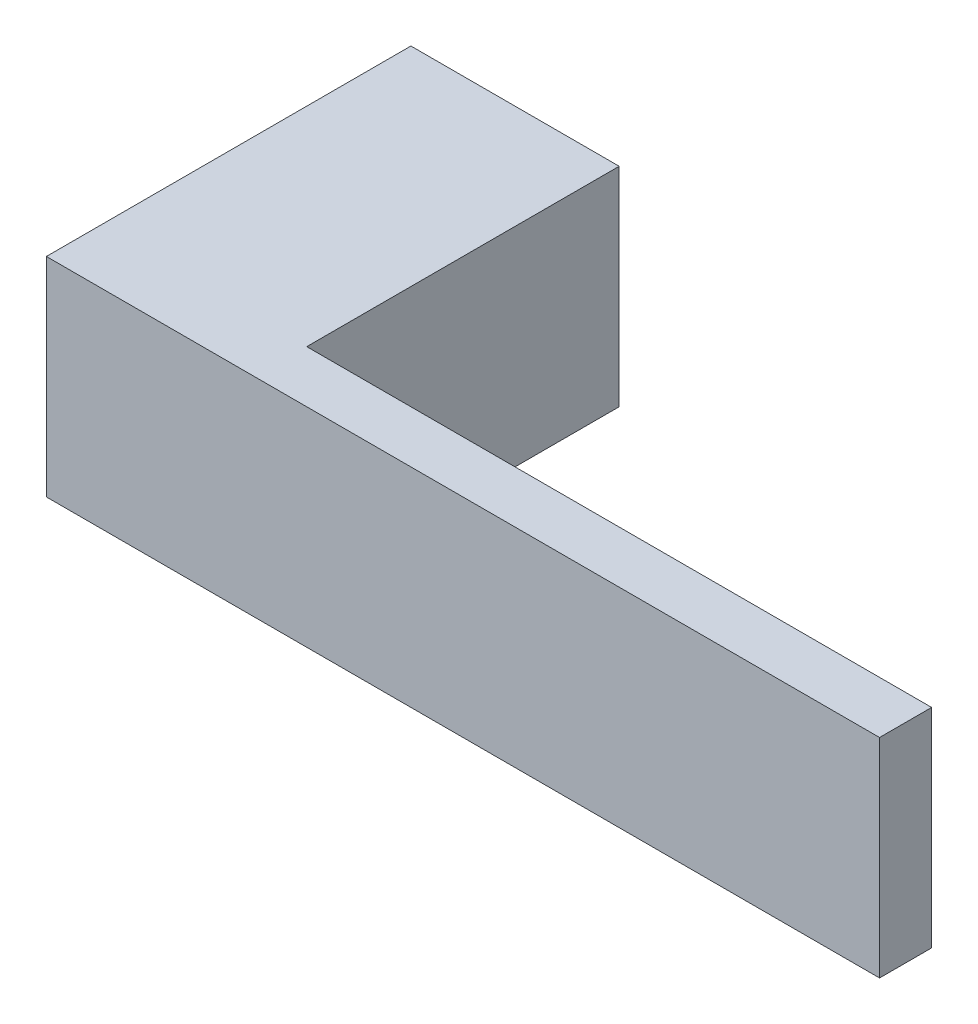
ISO-10303-21;
HEADER;
FILE_DESCRIPTION(('STEP AP214'),'2;1');
FILE_NAME('part.step','',(''),(''),'','','');
FILE_SCHEMA(('AUTOMOTIVE_DESIGN { 1 0 10303 214 1 1 1 1 }'));
ENDSEC;
DATA;
#1=APPLICATION_CONTEXT('core data for automotive mechanical design processes');
#2=APPLICATION_PROTOCOL_DEFINITION('international standard','automotive_design',2000,#1);
#3=PRODUCT_CONTEXT('',#1,'mechanical');
#4=PRODUCT('Part','Part','',(#3));
#5=PRODUCT_RELATED_PRODUCT_CATEGORY('part','',(#4));
#6=PRODUCT_DEFINITION_FORMATION('','',#4);
#7=PRODUCT_DEFINITION_CONTEXT('part definition',#1,'design');
#8=PRODUCT_DEFINITION('design','',#6,#7);
#9=PRODUCT_DEFINITION_SHAPE('','',#8);
#10=(LENGTH_UNIT() NAMED_UNIT(*) SI_UNIT(.MILLI.,.METRE.));
#11=(NAMED_UNIT(*) PLANE_ANGLE_UNIT() SI_UNIT($,.RADIAN.));
#12=(NAMED_UNIT(*) SI_UNIT($,.STERADIAN.) SOLID_ANGLE_UNIT());
#13=UNCERTAINTY_MEASURE_WITH_UNIT(LENGTH_MEASURE(1.E-05),#10,'distance_accuracy_value','');
#14=(GEOMETRIC_REPRESENTATION_CONTEXT(3) GLOBAL_UNCERTAINTY_ASSIGNED_CONTEXT((#13)) GLOBAL_UNIT_ASSIGNED_CONTEXT((#10,
#11,#12)) REPRESENTATION_CONTEXT('',''));
#15=CARTESIAN_POINT('',(0.,0.,0.));
#16=DIRECTION('',(0.,0.,1.));
#17=DIRECTION('',(1.,0.,0.));
#18=AXIS2_PLACEMENT_3D('',#15,#16,#17);
#19=CARTESIAN_POINT('',(80.,20.,35.));
#20=DIRECTION('',(-1.,0.,0.));
#21=DIRECTION('',(0.,0.,1.));
#22=AXIS2_PLACEMENT_3D('',#19,#20,#21);
#23=PLANE('',#22);
#24=DIRECTION('',(0.,0.,-1.));
#25=VECTOR('',#24,1.);
#26=CARTESIAN_POINT('',(80.,0.,35.));
#27=LINE('',#26,#25);
#28=CARTESIAN_POINT('',(80.,0.,35.));
#29=VERTEX_POINT('',#28);
#30=CARTESIAN_POINT('',(80.,0.,30.));
#31=VERTEX_POINT('',#30);
#32=EDGE_CURVE('E128',#29,#31,#27,.T.);
#33=ORIENTED_EDGE('',*,*,#32,.T.);
#34=DIRECTION('',(0.,-1.,0.));
#35=VECTOR('',#34,1.);
#36=CARTESIAN_POINT('',(80.,20.,30.));
#37=LINE('',#36,#35);
#38=CARTESIAN_POINT('',(80.,20.,30.));
#39=VERTEX_POINT('',#38);
#40=EDGE_CURVE('E11',#39,#31,#37,.T.);
#41=ORIENTED_EDGE('',*,*,#40,.F.);
#42=DIRECTION('',(0.,0.,-1.));
#43=VECTOR('',#42,1.);
#44=CARTESIAN_POINT('',(80.,20.,35.));
#45=LINE('',#44,#43);
#46=CARTESIAN_POINT('',(80.,20.,35.));
#47=VERTEX_POINT('',#46);
#48=EDGE_CURVE('E144',#47,#39,#45,.T.);
#49=ORIENTED_EDGE('',*,*,#48,.F.);
#50=DIRECTION('',(0.,-1.,0.));
#51=VECTOR('',#50,1.);
#52=CARTESIAN_POINT('',(80.,20.,35.));
#53=LINE('',#52,#51);
#54=EDGE_CURVE('E124',#47,#29,#53,.T.);
#55=ORIENTED_EDGE('',*,*,#54,.T.);
#56=EDGE_LOOP('',(#33,#41,#49,#55));
#57=FACE_BOUND('',#56,.T.);
#58=ADVANCED_FACE('F39',(#57),#23,.F.);
#59=CARTESIAN_POINT('',(80.,20.,30.));
#60=DIRECTION('',(0.,0.,1.));
#61=DIRECTION('',(1.,0.,0.));
#62=AXIS2_PLACEMENT_3D('',#59,#60,#61);
#63=PLANE('',#62);
#64=DIRECTION('',(-1.,0.,0.));
#65=VECTOR('',#64,1.);
#66=CARTESIAN_POINT('',(80.,0.,30.));
#67=LINE('',#66,#65);
#68=CARTESIAN_POINT('',(20.,0.,30.));
#69=VERTEX_POINT('',#68);
#70=EDGE_CURVE('E132',#31,#69,#67,.T.);
#71=ORIENTED_EDGE('',*,*,#70,.T.);
#72=DIRECTION('',(0.,-1.,0.));
#73=VECTOR('',#72,1.);
#74=CARTESIAN_POINT('',(20.,20.,30.));
#75=LINE('',#74,#73);
#76=CARTESIAN_POINT('',(20.,20.,30.));
#77=VERTEX_POINT('',#76);
#78=EDGE_CURVE('E48',#77,#69,#75,.T.);
#79=ORIENTED_EDGE('',*,*,#78,.F.);
#80=DIRECTION('',(-1.,0.,0.));
#81=VECTOR('',#80,1.);
#82=CARTESIAN_POINT('',(80.,20.,30.));
#83=LINE('',#82,#81);
#84=EDGE_CURVE('E93',#39,#77,#83,.T.);
#85=ORIENTED_EDGE('',*,*,#84,.F.);
#86=ORIENTED_EDGE('',*,*,#40,.T.);
#87=EDGE_LOOP('',(#71,#79,#85,#86));
#88=FACE_BOUND('',#87,.T.);
#89=ADVANCED_FACE('F172',(#88),#63,.F.);
#90=CARTESIAN_POINT('',(20.,20.,30.));
#91=DIRECTION('',(-1.,0.,0.));
#92=DIRECTION('',(0.,0.,1.));
#93=AXIS2_PLACEMENT_3D('',#90,#91,#92);
#94=PLANE('',#93);
#95=DIRECTION('',(0.,0.,-1.));
#96=VECTOR('',#95,1.);
#97=CARTESIAN_POINT('',(20.,0.,30.));
#98=LINE('',#97,#96);
#99=CARTESIAN_POINT('',(20.,0.,0.));
#100=VERTEX_POINT('',#99);
#101=EDGE_CURVE('E135',#69,#100,#98,.T.);
#102=ORIENTED_EDGE('',*,*,#101,.T.);
#103=DIRECTION('',(0.,-1.,0.));
#104=VECTOR('',#103,1.);
#105=CARTESIAN_POINT('',(20.,20.,0.));
#106=LINE('',#105,#104);
#107=CARTESIAN_POINT('',(20.,20.,0.));
#108=VERTEX_POINT('',#107);
#109=EDGE_CURVE('E117',#108,#100,#106,.T.);
#110=ORIENTED_EDGE('',*,*,#109,.F.);
#111=DIRECTION('',(0.,0.,-1.));
#112=VECTOR('',#111,1.);
#113=CARTESIAN_POINT('',(20.,20.,30.));
#114=LINE('',#113,#112);
#115=EDGE_CURVE('E106',#77,#108,#114,.T.);
#116=ORIENTED_EDGE('',*,*,#115,.F.);
#117=ORIENTED_EDGE('',*,*,#78,.T.);
#118=EDGE_LOOP('',(#102,#110,#116,#117));
#119=FACE_BOUND('',#118,.T.);
#120=ADVANCED_FACE('F154',(#119),#94,.F.);
#121=CARTESIAN_POINT('',(0.,20.,0.));
#122=DIRECTION('',(0.,0.,1.));
#123=DIRECTION('',(1.,0.,0.));
#124=AXIS2_PLACEMENT_3D('',#121,#122,#123);
#125=PLANE('',#124);
#126=DIRECTION('',(-1.,0.,0.));
#127=VECTOR('',#126,1.);
#128=CARTESIAN_POINT('',(0.,0.,0.));
#129=LINE('',#128,#127);
#130=CARTESIAN_POINT('',(0.,0.,0.));
#131=VERTEX_POINT('',#130);
#132=EDGE_CURVE('E115',#100,#131,#129,.T.);
#133=ORIENTED_EDGE('',*,*,#132,.T.);
#134=DIRECTION('',(0.,-1.,0.));
#135=VECTOR('',#134,1.);
#136=CARTESIAN_POINT('',(0.,20.,0.));
#137=LINE('',#136,#135);
#138=CARTESIAN_POINT('',(0.,20.,0.));
#139=VERTEX_POINT('',#138);
#140=EDGE_CURVE('E112',#139,#131,#137,.T.);
#141=ORIENTED_EDGE('',*,*,#140,.F.);
#142=DIRECTION('',(-1.,0.,0.));
#143=VECTOR('',#142,1.);
#144=CARTESIAN_POINT('',(0.,20.,0.));
#145=LINE('',#144,#143);
#146=EDGE_CURVE('E100',#108,#139,#145,.T.);
#147=ORIENTED_EDGE('',*,*,#146,.F.);
#148=ORIENTED_EDGE('',*,*,#109,.T.);
#149=EDGE_LOOP('',(#133,#141,#147,#148));
#150=FACE_BOUND('',#149,.T.);
#151=ADVANCED_FACE('F113',(#150),#125,.F.);
#152=CARTESIAN_POINT('',(0.,20.,35.));
#153=DIRECTION('',(1.,0.,0.));
#154=DIRECTION('',(0.,0.,-1.));
#155=AXIS2_PLACEMENT_3D('',#152,#153,#154);
#156=PLANE('',#155);
#157=DIRECTION('',(0.,0.,1.));
#158=VECTOR('',#157,1.);
#159=CARTESIAN_POINT('',(0.,0.,35.));
#160=LINE('',#159,#158);
#161=CARTESIAN_POINT('',(0.,0.,35.));
#162=VERTEX_POINT('',#161);
#163=EDGE_CURVE('E79',#131,#162,#160,.T.);
#164=ORIENTED_EDGE('',*,*,#163,.T.);
#165=DIRECTION('',(0.,-1.,0.));
#166=VECTOR('',#165,1.);
#167=CARTESIAN_POINT('',(0.,20.,35.));
#168=LINE('',#167,#166);
#169=CARTESIAN_POINT('',(0.,20.,35.));
#170=VERTEX_POINT('',#169);
#171=EDGE_CURVE('E118',#170,#162,#168,.T.);
#172=ORIENTED_EDGE('',*,*,#171,.F.);
#173=DIRECTION('',(0.,0.,1.));
#174=VECTOR('',#173,1.);
#175=CARTESIAN_POINT('',(0.,20.,35.));
#176=LINE('',#175,#174);
#177=EDGE_CURVE('E104',#139,#170,#176,.T.);
#178=ORIENTED_EDGE('',*,*,#177,.F.);
#179=ORIENTED_EDGE('',*,*,#140,.T.);
#180=EDGE_LOOP('',(#164,#172,#178,#179));
#181=FACE_BOUND('',#180,.T.);
#182=ADVANCED_FACE('F120',(#181),#156,.F.);
#183=CARTESIAN_POINT('',(80.,20.,35.));
#184=DIRECTION('',(0.,0.,-1.));
#185=DIRECTION('',(-1.,0.,0.));
#186=AXIS2_PLACEMENT_3D('',#183,#184,#185);
#187=PLANE('',#186);
#188=DIRECTION('',(1.,0.,0.));
#189=VECTOR('',#188,1.);
#190=CARTESIAN_POINT('',(80.,0.,35.));
#191=LINE('',#190,#189);
#192=EDGE_CURVE('E85',#162,#29,#191,.T.);
#193=ORIENTED_EDGE('',*,*,#192,.T.);
#194=ORIENTED_EDGE('',*,*,#54,.F.);
#195=DIRECTION('',(1.,0.,0.));
#196=VECTOR('',#195,1.);
#197=CARTESIAN_POINT('',(80.,20.,35.));
#198=LINE('',#197,#196);
#199=EDGE_CURVE('E56',#170,#47,#198,.T.);
#200=ORIENTED_EDGE('',*,*,#199,.F.);
#201=ORIENTED_EDGE('',*,*,#171,.T.);
#202=EDGE_LOOP('',(#193,#194,#200,#201));
#203=FACE_BOUND('',#202,.T.);
#204=ADVANCED_FACE('F161',(#203),#187,.F.);
#205=CARTESIAN_POINT('',(0.,20.,0.));
#206=DIRECTION('',(0.,1.,0.));
#207=DIRECTION('',(0.,0.,1.));
#208=AXIS2_PLACEMENT_3D('',#205,#206,#207);
#209=PLANE('',#208);
#210=ORIENTED_EDGE('',*,*,#48,.T.);
#211=ORIENTED_EDGE('',*,*,#84,.T.);
#212=ORIENTED_EDGE('',*,*,#115,.T.);
#213=ORIENTED_EDGE('',*,*,#146,.T.);
#214=ORIENTED_EDGE('',*,*,#177,.T.);
#215=ORIENTED_EDGE('',*,*,#199,.T.);
#216=EDGE_LOOP('',(#210,#211,#212,#213,#214,#215));
#217=FACE_BOUND('',#216,.T.);
#218=ADVANCED_FACE('F102',(#217),#209,.T.);
#219=CARTESIAN_POINT('',(0.,0.,0.));
#220=DIRECTION('',(0.,1.,0.));
#221=DIRECTION('',(0.,0.,1.));
#222=AXIS2_PLACEMENT_3D('',#219,#220,#221);
#223=PLANE('',#222);
#224=ORIENTED_EDGE('',*,*,#32,.F.);
#225=ORIENTED_EDGE('',*,*,#192,.F.);
#226=ORIENTED_EDGE('',*,*,#163,.F.);
#227=ORIENTED_EDGE('',*,*,#132,.F.);
#228=ORIENTED_EDGE('',*,*,#101,.F.);
#229=ORIENTED_EDGE('',*,*,#70,.F.);
#230=EDGE_LOOP('',(#224,#225,#226,#227,#228,#229));
#231=FACE_BOUND('',#230,.T.);
#232=ADVANCED_FACE('F157',(#231),#223,.F.);
#233=CLOSED_SHELL('',(#58,#89,#120,#151,#182,#204,#218,#232));
#234=MANIFOLD_SOLID_BREP('B2',#233);
#235=ADVANCED_BREP_SHAPE_REPRESENTATION('',(#18,#234),#14);
#236=SHAPE_DEFINITION_REPRESENTATION(#9,#235);
ENDSEC;
END-ISO-10303-21;
